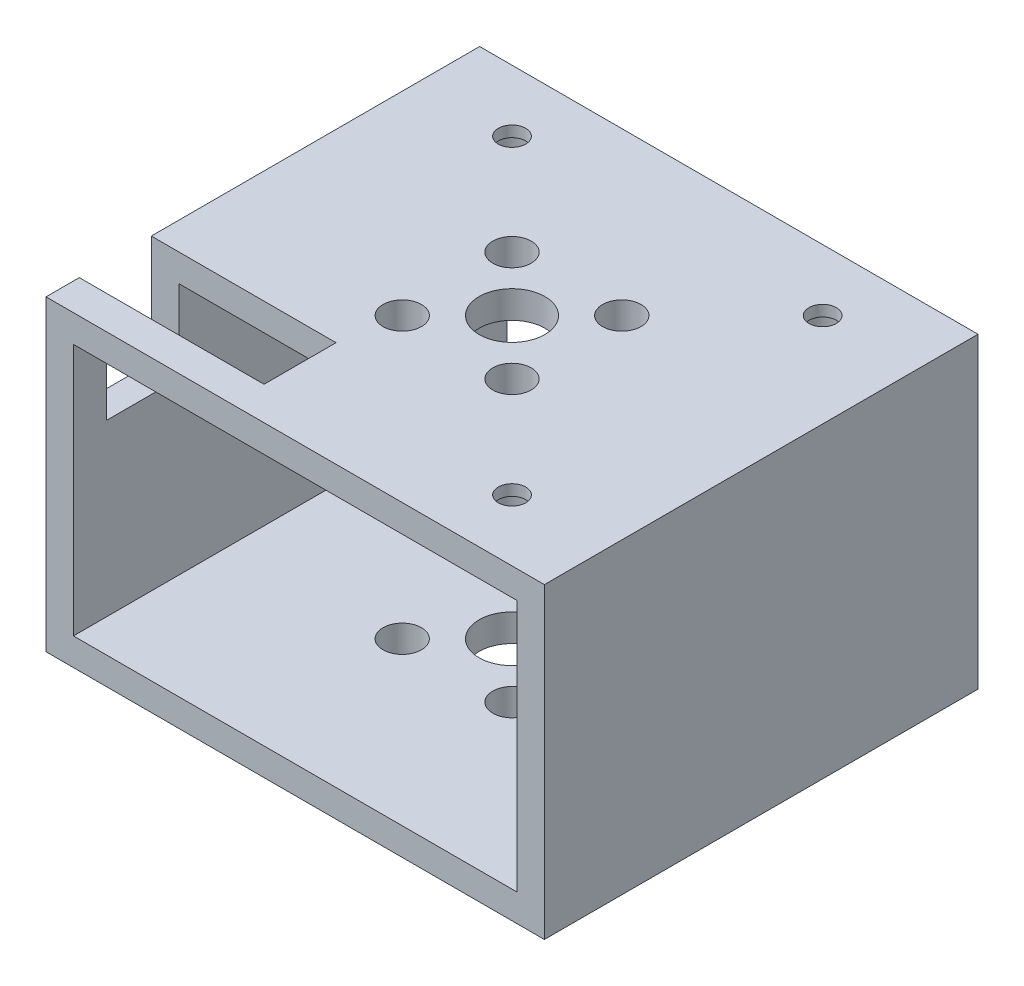
ISO-10303-21;
HEADER;
FILE_DESCRIPTION(('STEP AP214'),'2;1');
FILE_NAME('part.step','',(''),(''),'','','');
FILE_SCHEMA(('AUTOMOTIVE_DESIGN { 1 0 10303 214 1 1 1 1 }'));
ENDSEC;
DATA;
#1=APPLICATION_CONTEXT('core data for automotive mechanical design processes');
#2=APPLICATION_PROTOCOL_DEFINITION('international standard','automotive_design',2000,#1);
#3=PRODUCT_CONTEXT('',#1,'mechanical');
#4=PRODUCT('Part','Part','',(#3));
#5=PRODUCT_RELATED_PRODUCT_CATEGORY('part','',(#4));
#6=PRODUCT_DEFINITION_FORMATION('','',#4);
#7=PRODUCT_DEFINITION_CONTEXT('part definition',#1,'design');
#8=PRODUCT_DEFINITION('design','',#6,#7);
#9=PRODUCT_DEFINITION_SHAPE('','',#8);
#10=(LENGTH_UNIT() NAMED_UNIT(*) SI_UNIT(.MILLI.,.METRE.));
#11=(NAMED_UNIT(*) PLANE_ANGLE_UNIT() SI_UNIT($,.RADIAN.));
#12=(NAMED_UNIT(*) SI_UNIT($,.STERADIAN.) SOLID_ANGLE_UNIT());
#13=UNCERTAINTY_MEASURE_WITH_UNIT(LENGTH_MEASURE(1.E-05),#10,'distance_accuracy_value','');
#14=(GEOMETRIC_REPRESENTATION_CONTEXT(3) GLOBAL_UNCERTAINTY_ASSIGNED_CONTEXT((#13)) GLOBAL_UNIT_ASSIGNED_CONTEXT((#10,
#11,#12)) REPRESENTATION_CONTEXT('',''));
#15=CARTESIAN_POINT('',(0.,0.,0.));
#16=DIRECTION('',(0.,0.,1.));
#17=DIRECTION('',(1.,0.,0.));
#18=AXIS2_PLACEMENT_3D('',#15,#16,#17);
#19=CARTESIAN_POINT('',(14.15,-7.5,-14.15));
#20=DIRECTION('',(0.,1.,0.));
#21=DIRECTION('',(0.,0.,1.));
#22=AXIS2_PLACEMENT_3D('',#19,#20,#21);
#23=CYLINDRICAL_SURFACE('',#22,1.25);
#24=CARTESIAN_POINT('',(14.15,2.5,-14.15));
#25=DIRECTION('',(0.,1.,0.));
#26=DIRECTION('',(0.,0.,1.));
#27=AXIS2_PLACEMENT_3D('',#24,#25,#26);
#28=CIRCLE('',#27,1.25);
#29=CARTESIAN_POINT('',(14.15,2.5,-12.9));
#30=VERTEX_POINT('',#29);
#31=EDGE_CURVE('E225',#30,#30,#28,.T.);
#32=ORIENTED_EDGE('',*,*,#31,.T.);
#33=EDGE_LOOP('',(#32));
#34=FACE_BOUND('',#33,.T.);
#35=CARTESIAN_POINT('',(14.15,1.5,-14.15));
#36=DIRECTION('',(0.,-1.,0.));
#37=DIRECTION('',(0.,0.,-1.));
#38=AXIS2_PLACEMENT_3D('',#35,#36,#37);
#39=CIRCLE('',#38,1.25);
#40=CARTESIAN_POINT('',(14.15,1.5,-15.4));
#41=VERTEX_POINT('',#40);
#42=EDGE_CURVE('E229',#41,#41,#39,.F.);
#43=ORIENTED_EDGE('',*,*,#42,.F.);
#44=EDGE_LOOP('',(#43));
#45=FACE_BOUND('',#44,.T.);
#46=ADVANCED_FACE('F41',(#34,#45),#23,.F.);
#47=CARTESIAN_POINT('',(14.1500000000008,-7.5,14.15));
#48=DIRECTION('',(0.,1.,0.));
#49=DIRECTION('',(0.,0.,1.));
#50=AXIS2_PLACEMENT_3D('',#47,#48,#49);
#51=CYLINDRICAL_SURFACE('',#50,1.25);
#52=CARTESIAN_POINT('',(14.1500000000008,2.5,14.15));
#53=DIRECTION('',(0.,1.,0.));
#54=DIRECTION('',(0.,0.,1.));
#55=AXIS2_PLACEMENT_3D('',#52,#53,#54);
#56=CIRCLE('',#55,1.25);
#57=CARTESIAN_POINT('',(14.1500000000008,2.5,15.4));
#58=VERTEX_POINT('',#57);
#59=EDGE_CURVE('E222',#58,#58,#56,.T.);
#60=ORIENTED_EDGE('',*,*,#59,.T.);
#61=EDGE_LOOP('',(#60));
#62=FACE_BOUND('',#61,.T.);
#63=CARTESIAN_POINT('',(14.1500000000008,1.5,14.15));
#64=DIRECTION('',(0.,-1.,0.));
#65=DIRECTION('',(0.,0.,-1.));
#66=AXIS2_PLACEMENT_3D('',#63,#64,#65);
#67=CIRCLE('',#66,1.25);
#68=CARTESIAN_POINT('',(14.1500000000008,1.5,12.9));
#69=VERTEX_POINT('',#68);
#70=EDGE_CURVE('E391',#69,#69,#67,.F.);
#71=ORIENTED_EDGE('',*,*,#70,.F.);
#72=EDGE_LOOP('',(#71));
#73=FACE_BOUND('',#72,.T.);
#74=ADVANCED_FACE('F399',(#62,#73),#51,.F.);
#75=CARTESIAN_POINT('',(-14.15,-7.5,-14.1499999999992));
#76=DIRECTION('',(0.,1.,0.));
#77=DIRECTION('',(0.,0.,1.));
#78=AXIS2_PLACEMENT_3D('',#75,#76,#77);
#79=CYLINDRICAL_SURFACE('',#78,1.25);
#80=CARTESIAN_POINT('',(-14.15,2.5,-14.1499999999992));
#81=DIRECTION('',(0.,1.,0.));
#82=DIRECTION('',(0.,0.,1.));
#83=AXIS2_PLACEMENT_3D('',#80,#81,#82);
#84=CIRCLE('',#83,1.25);
#85=CARTESIAN_POINT('',(-14.15,2.5,-12.8999999999992));
#86=VERTEX_POINT('',#85);
#87=EDGE_CURVE('E226',#86,#86,#84,.T.);
#88=ORIENTED_EDGE('',*,*,#87,.T.);
#89=EDGE_LOOP('',(#88));
#90=FACE_BOUND('',#89,.T.);
#91=CARTESIAN_POINT('',(-14.15,1.5,-14.1499999999992));
#92=DIRECTION('',(0.,-1.,0.));
#93=DIRECTION('',(0.,0.,-1.));
#94=AXIS2_PLACEMENT_3D('',#91,#92,#93);
#95=CIRCLE('',#94,1.25);
#96=CARTESIAN_POINT('',(-14.15,1.5,-15.3999999999992));
#97=VERTEX_POINT('',#96);
#98=EDGE_CURVE('E219',#97,#97,#95,.F.);
#99=ORIENTED_EDGE('',*,*,#98,.F.);
#100=EDGE_LOOP('',(#99));
#101=FACE_BOUND('',#100,.T.);
#102=ADVANCED_FACE('F405',(#90,#101),#79,.F.);
#103=CARTESIAN_POINT('',(0.,2.5,-19.75));
#104=DIRECTION('',(0.,0.,-1.));
#105=DIRECTION('',(-1.,0.,0.));
#106=AXIS2_PLACEMENT_3D('',#103,#104,#105);
#107=PLANE('',#106);
#108=DIRECTION('',(1.,0.,0.));
#109=VECTOR('',#108,1.);
#110=CARTESIAN_POINT('',(-25.,-23.,-19.75));
#111=LINE('',#110,#109);
#112=CARTESIAN_POINT('',(-20.2,-23.,-19.75));
#113=VERTEX_POINT('',#112);
#114=CARTESIAN_POINT('',(20.2,-23.,-19.75));
#115=VERTEX_POINT('',#114);
#116=EDGE_CURVE('E319',#113,#115,#111,.T.);
#117=ORIENTED_EDGE('',*,*,#116,.T.);
#118=DIRECTION('',(0.,-1.,0.));
#119=VECTOR('',#118,1.);
#120=CARTESIAN_POINT('',(20.2,3.5,-19.75));
#121=LINE('',#120,#119);
#122=CARTESIAN_POINT('',(20.2,0.,-19.75));
#123=VERTEX_POINT('',#122);
#124=EDGE_CURVE('E255',#123,#115,#121,.T.);
#125=ORIENTED_EDGE('',*,*,#124,.F.);
#126=DIRECTION('',(1.,0.,0.));
#127=VECTOR('',#126,1.);
#128=CARTESIAN_POINT('',(0.,0.,-19.75));
#129=LINE('',#128,#127);
#130=CARTESIAN_POINT('',(-20.2,0.,-19.75));
#131=VERTEX_POINT('',#130);
#132=EDGE_CURVE('E368',#131,#123,#129,.T.);
#133=ORIENTED_EDGE('',*,*,#132,.F.);
#134=DIRECTION('',(0.,-1.,0.));
#135=VECTOR('',#134,1.);
#136=CARTESIAN_POINT('',(-20.2,3.5,-19.75));
#137=LINE('',#136,#135);
#138=EDGE_CURVE('E262',#131,#113,#137,.T.);
#139=ORIENTED_EDGE('',*,*,#138,.T.);
#140=EDGE_LOOP('',(#117,#125,#133,#139));
#141=FACE_BOUND('',#140,.T.);
#142=DIRECTION('',(-1.,0.,0.));
#143=VECTOR('',#142,1.);
#144=CARTESIAN_POINT('',(25.,-25.5,-19.75));
#145=LINE('',#144,#143);
#146=CARTESIAN_POINT('',(22.7,-25.5,-19.75));
#147=VERTEX_POINT('',#146);
#148=CARTESIAN_POINT('',(-22.7,-25.5,-19.75));
#149=VERTEX_POINT('',#148);
#150=EDGE_CURVE('E329',#147,#149,#145,.T.);
#151=ORIENTED_EDGE('',*,*,#150,.T.);
#152=DIRECTION('',(0.,-1.,0.));
#153=VECTOR('',#152,1.);
#154=CARTESIAN_POINT('',(-22.7,2.5,-19.75));
#155=LINE('',#154,#153);
#156=CARTESIAN_POINT('',(-22.7,2.5,-19.75));
#157=VERTEX_POINT('',#156);
#158=EDGE_CURVE('E233',#157,#149,#155,.T.);
#159=ORIENTED_EDGE('',*,*,#158,.F.);
#160=DIRECTION('',(1.,0.,0.));
#161=VECTOR('',#160,1.);
#162=CARTESIAN_POINT('',(0.,2.5,-19.75));
#163=LINE('',#162,#161);
#164=CARTESIAN_POINT('',(22.7,2.5,-19.75));
#165=VERTEX_POINT('',#164);
#166=EDGE_CURVE('E349',#157,#165,#163,.T.);
#167=ORIENTED_EDGE('',*,*,#166,.T.);
#168=DIRECTION('',(0.,1.,0.));
#169=VECTOR('',#168,1.);
#170=CARTESIAN_POINT('',(22.7,2.5,-19.75));
#171=LINE('',#170,#169);
#172=EDGE_CURVE('E235',#147,#165,#171,.T.);
#173=ORIENTED_EDGE('',*,*,#172,.F.);
#174=EDGE_LOOP('',(#151,#159,#167,#173));
#175=FACE_BOUND('',#174,.T.);
#176=ADVANCED_FACE('F481',(#141,#175),#107,.T.);
#177=CARTESIAN_POINT('',(0.,2.5,19.75));
#178=DIRECTION('',(0.,0.,-1.));
#179=DIRECTION('',(-1.,0.,0.));
#180=AXIS2_PLACEMENT_3D('',#177,#178,#179);
#181=PLANE('',#180);
#182=DIRECTION('',(0.,-1.,0.));
#183=VECTOR('',#182,1.);
#184=CARTESIAN_POINT('',(20.2,3.5,19.75));
#185=LINE('',#184,#183);
#186=CARTESIAN_POINT('',(20.2,0.,19.75));
#187=VERTEX_POINT('',#186);
#188=CARTESIAN_POINT('',(20.2,-23.,19.75));
#189=VERTEX_POINT('',#188);
#190=EDGE_CURVE('E247',#187,#189,#185,.T.);
#191=ORIENTED_EDGE('',*,*,#190,.T.);
#192=DIRECTION('',(-1.,0.,0.));
#193=VECTOR('',#192,1.);
#194=CARTESIAN_POINT('',(25.,-23.,19.75));
#195=LINE('',#194,#193);
#196=CARTESIAN_POINT('',(-20.2,-23.,19.75));
#197=VERTEX_POINT('',#196);
#198=EDGE_CURVE('E324',#189,#197,#195,.T.);
#199=ORIENTED_EDGE('',*,*,#198,.T.);
#200=DIRECTION('',(0.,-1.,0.));
#201=VECTOR('',#200,1.);
#202=CARTESIAN_POINT('',(-20.2,3.5,19.75));
#203=LINE('',#202,#201);
#204=CARTESIAN_POINT('',(-20.2,0.,19.75));
#205=VERTEX_POINT('',#204);
#206=EDGE_CURVE('E261',#205,#197,#203,.T.);
#207=ORIENTED_EDGE('',*,*,#206,.F.);
#208=DIRECTION('',(1.,0.,0.));
#209=VECTOR('',#208,1.);
#210=CARTESIAN_POINT('',(0.,0.,19.75));
#211=LINE('',#210,#209);
#212=EDGE_CURVE('E337',#205,#187,#211,.T.);
#213=ORIENTED_EDGE('',*,*,#212,.T.);
#214=EDGE_LOOP('',(#191,#199,#207,#213));
#215=FACE_BOUND('',#214,.T.);
#216=DIRECTION('',(0.,-1.,0.));
#217=VECTOR('',#216,1.);
#218=CARTESIAN_POINT('',(-22.7,2.5,19.75));
#219=LINE('',#218,#217);
#220=CARTESIAN_POINT('',(-22.7,2.5,19.75));
#221=VERTEX_POINT('',#220);
#222=CARTESIAN_POINT('',(-22.7,-25.5,19.75));
#223=VERTEX_POINT('',#222);
#224=EDGE_CURVE('E232',#221,#223,#219,.T.);
#225=ORIENTED_EDGE('',*,*,#224,.T.);
#226=DIRECTION('',(1.,0.,0.));
#227=VECTOR('',#226,1.);
#228=CARTESIAN_POINT('',(25.,-25.5,19.75));
#229=LINE('',#228,#227);
#230=CARTESIAN_POINT('',(22.7,-25.5,19.75));
#231=VERTEX_POINT('',#230);
#232=EDGE_CURVE('E326',#223,#231,#229,.T.);
#233=ORIENTED_EDGE('',*,*,#232,.T.);
#234=DIRECTION('',(0.,1.,0.));
#235=VECTOR('',#234,1.);
#236=CARTESIAN_POINT('',(22.7,2.5,19.75));
#237=LINE('',#236,#235);
#238=CARTESIAN_POINT('',(22.7,2.5,19.75));
#239=VERTEX_POINT('',#238);
#240=EDGE_CURVE('E236',#231,#239,#237,.T.);
#241=ORIENTED_EDGE('',*,*,#240,.T.);
#242=DIRECTION('',(1.,0.,0.));
#243=VECTOR('',#242,1.);
#244=CARTESIAN_POINT('',(0.,2.5,19.75));
#245=LINE('',#244,#243);
#246=EDGE_CURVE('E351',#221,#239,#245,.T.);
#247=ORIENTED_EDGE('',*,*,#246,.F.);
#248=EDGE_LOOP('',(#225,#233,#241,#247));
#249=FACE_BOUND('',#248,.T.);
#250=ADVANCED_FACE('F470',(#215,#249),#181,.F.);
#251=CARTESIAN_POINT('',(0.,-25.5,0.));
#252=DIRECTION('',(0.,-1.,0.));
#253=DIRECTION('',(0.,0.,-1.));
#254=AXIS2_PLACEMENT_3D('',#251,#252,#253);
#255=PLANE('',#254);
#256=DIRECTION('',(0.,0.,-1.));
#257=VECTOR('',#256,1.);
#258=CARTESIAN_POINT('',(-18.8746957556807,-25.5,-8.48334455744631));
#259=LINE('',#258,#257);
#260=CARTESIAN_POINT('',(-18.8746957556807,-25.5,-8.48334455744631));
#261=VERTEX_POINT('',#260);
#262=CARTESIAN_POINT('',(-18.8746957556807,-25.5,-17.7501379555667));
#263=VERTEX_POINT('',#262);
#264=EDGE_CURVE('E271',#261,#263,#259,.T.);
#265=ORIENTED_EDGE('',*,*,#264,.F.);
#266=DIRECTION('',(-1.,0.,0.));
#267=VECTOR('',#266,1.);
#268=CARTESIAN_POINT('',(-18.8746957556807,-25.5,-8.48334455744631));
#269=LINE('',#268,#267);
#270=CARTESIAN_POINT('',(-1.93295077016008,-25.5,-8.48334455744631));
#271=VERTEX_POINT('',#270);
#272=EDGE_CURVE('E279',#271,#261,#269,.T.);
#273=ORIENTED_EDGE('',*,*,#272,.F.);
#274=DIRECTION('',(0.,0.,1.));
#275=VECTOR('',#274,1.);
#276=CARTESIAN_POINT('',(-1.93295077016008,-25.5,-8.48334455744631));
#277=LINE('',#276,#275);
#278=CARTESIAN_POINT('',(-1.93295077016008,-25.5,-17.7501379555667));
#279=VERTEX_POINT('',#278);
#280=EDGE_CURVE('E276',#279,#271,#277,.T.);
#281=ORIENTED_EDGE('',*,*,#280,.F.);
#282=DIRECTION('',(1.,0.,0.));
#283=VECTOR('',#282,1.);
#284=CARTESIAN_POINT('',(-18.8746957556807,-25.5,-17.7501379555667));
#285=LINE('',#284,#283);
#286=EDGE_CURVE('E273',#263,#279,#285,.T.);
#287=ORIENTED_EDGE('',*,*,#286,.F.);
#288=EDGE_LOOP('',(#265,#273,#281,#287));
#289=FACE_BOUND('',#288,.T.);
#290=CARTESIAN_POINT('',(0.,-25.5,0.));
#291=DIRECTION('',(0.,-1.,0.));
#292=DIRECTION('',(0.,0.,-1.));
#293=AXIS2_PLACEMENT_3D('',#290,#291,#292);
#294=CIRCLE('',#293,3.);
#295=CARTESIAN_POINT('',(0.,-25.5,-3.));
#296=VERTEX_POINT('',#295);
#297=EDGE_CURVE('E285',#296,#296,#294,.T.);
#298=ORIENTED_EDGE('',*,*,#297,.F.);
#299=EDGE_LOOP('',(#298));
#300=FACE_BOUND('',#299,.T.);
#301=CARTESIAN_POINT('',(-5.,-25.5,-5.));
#302=DIRECTION('',(0.,-1.,0.));
#303=DIRECTION('',(0.,0.,-1.));
#304=AXIS2_PLACEMENT_3D('',#301,#302,#303);
#305=CIRCLE('',#304,1.75);
#306=CARTESIAN_POINT('',(-5.,-25.5,-6.75));
#307=VERTEX_POINT('',#306);
#308=EDGE_CURVE('E295',#307,#307,#305,.T.);
#309=ORIENTED_EDGE('',*,*,#308,.F.);
#310=EDGE_LOOP('',(#309));
#311=FACE_BOUND('',#310,.T.);
#312=CARTESIAN_POINT('',(5.,-25.5,-5.00000000000028));
#313=DIRECTION('',(0.,-1.,0.));
#314=DIRECTION('',(0.,0.,-1.));
#315=AXIS2_PLACEMENT_3D('',#312,#313,#314);
#316=CIRCLE('',#315,1.75000000000029);
#317=CARTESIAN_POINT('',(5.,-25.5,-6.75000000000057));
#318=VERTEX_POINT('',#317);
#319=EDGE_CURVE('E301',#318,#318,#316,.T.);
#320=ORIENTED_EDGE('',*,*,#319,.F.);
#321=EDGE_LOOP('',(#320));
#322=FACE_BOUND('',#321,.T.);
#323=CARTESIAN_POINT('',(5.00000000000028,-25.5,4.99999999999972));
#324=DIRECTION('',(0.,-1.,0.));
#325=DIRECTION('',(0.,0.,-1.));
#326=AXIS2_PLACEMENT_3D('',#323,#324,#325);
#327=CIRCLE('',#326,1.7500000000004);
#328=CARTESIAN_POINT('',(5.00000000000028,-25.5,3.24999999999933));
#329=VERTEX_POINT('',#328);
#330=EDGE_CURVE('E307',#329,#329,#327,.T.);
#331=ORIENTED_EDGE('',*,*,#330,.F.);
#332=EDGE_LOOP('',(#331));
#333=FACE_BOUND('',#332,.T.);
#334=CARTESIAN_POINT('',(-4.99999999999972,-25.5,5.));
#335=DIRECTION('',(0.,-1.,0.));
#336=DIRECTION('',(0.,0.,-1.));
#337=AXIS2_PLACEMENT_3D('',#334,#335,#336);
#338=CIRCLE('',#337,1.75000000000015);
#339=CARTESIAN_POINT('',(-4.99999999999972,-25.5,3.24999999999985));
#340=VERTEX_POINT('',#339);
#341=EDGE_CURVE('E313',#340,#340,#338,.T.);
#342=ORIENTED_EDGE('',*,*,#341,.F.);
#343=EDGE_LOOP('',(#342));
#344=FACE_BOUND('',#343,.T.);
#345=ORIENTED_EDGE('',*,*,#232,.F.);
#346=DIRECTION('',(0.,0.,1.));
#347=VECTOR('',#346,1.);
#348=CARTESIAN_POINT('',(-22.7,-25.5,-19.75));
#349=LINE('',#348,#347);
#350=EDGE_CURVE('E239',#149,#223,#349,.T.);
#351=ORIENTED_EDGE('',*,*,#350,.F.);
#352=ORIENTED_EDGE('',*,*,#150,.F.);
#353=DIRECTION('',(0.,0.,1.));
#354=VECTOR('',#353,1.);
#355=CARTESIAN_POINT('',(22.7,-25.5,-19.75));
#356=LINE('',#355,#354);
#357=EDGE_CURVE('E251',#147,#231,#356,.T.);
#358=ORIENTED_EDGE('',*,*,#357,.T.);
#359=EDGE_LOOP('',(#345,#351,#352,#358));
#360=FACE_BOUND('',#359,.T.);
#361=ADVANCED_FACE('F466',(#289,#300,#311,#322,#333,#344,#360),#255,.T.);
#362=CARTESIAN_POINT('',(0.,2.5,0.));
#363=DIRECTION('',(0.,-1.,0.));
#364=DIRECTION('',(0.,0.,-1.));
#365=AXIS2_PLACEMENT_3D('',#362,#363,#364);
#366=CYLINDRICAL_SURFACE('',#365,3.);
#367=CARTESIAN_POINT('',(0.,2.5,0.));
#368=DIRECTION('',(0.,1.,0.));
#369=DIRECTION('',(0.,0.,1.));
#370=AXIS2_PLACEMENT_3D('',#367,#368,#369);
#371=CIRCLE('',#370,3.);
#372=CARTESIAN_POINT('',(0.,2.5,3.));
#373=VERTEX_POINT('',#372);
#374=EDGE_CURVE('E346',#373,#373,#371,.T.);
#375=ORIENTED_EDGE('',*,*,#374,.T.);
#376=EDGE_LOOP('',(#375));
#377=FACE_BOUND('',#376,.T.);
#378=CARTESIAN_POINT('',(0.,0.,0.));
#379=DIRECTION('',(0.,1.,0.));
#380=DIRECTION('',(0.,0.,1.));
#381=AXIS2_PLACEMENT_3D('',#378,#379,#380);
#382=CIRCLE('',#381,3.);
#383=CARTESIAN_POINT('',(0.,0.,3.));
#384=VERTEX_POINT('',#383);
#385=EDGE_CURVE('E365',#384,#384,#382,.T.);
#386=ORIENTED_EDGE('',*,*,#385,.F.);
#387=EDGE_LOOP('',(#386));
#388=FACE_BOUND('',#387,.T.);
#389=ADVANCED_FACE('F469',(#377,#388),#366,.F.);
#390=CARTESIAN_POINT('',(-5.,2.5,-5.));
#391=DIRECTION('',(0.,-1.,0.));
#392=DIRECTION('',(0.,0.,-1.));
#393=AXIS2_PLACEMENT_3D('',#390,#391,#392);
#394=CYLINDRICAL_SURFACE('',#393,1.75);
#395=CARTESIAN_POINT('',(-5.,2.5,-5.));
#396=DIRECTION('',(0.,1.,0.));
#397=DIRECTION('',(0.,0.,1.));
#398=AXIS2_PLACEMENT_3D('',#395,#396,#397);
#399=CIRCLE('',#398,1.75);
#400=CARTESIAN_POINT('',(-5.,2.5,-3.25));
#401=VERTEX_POINT('',#400);
#402=EDGE_CURVE('E343',#401,#401,#399,.T.);
#403=ORIENTED_EDGE('',*,*,#402,.T.);
#404=EDGE_LOOP('',(#403));
#405=FACE_BOUND('',#404,.T.);
#406=CARTESIAN_POINT('',(-5.,0.,-5.));
#407=DIRECTION('',(0.,1.,0.));
#408=DIRECTION('',(0.,0.,1.));
#409=AXIS2_PLACEMENT_3D('',#406,#407,#408);
#410=CIRCLE('',#409,1.75);
#411=CARTESIAN_POINT('',(-5.,0.,-3.25));
#412=VERTEX_POINT('',#411);
#413=EDGE_CURVE('E362',#412,#412,#410,.T.);
#414=ORIENTED_EDGE('',*,*,#413,.F.);
#415=EDGE_LOOP('',(#414));
#416=FACE_BOUND('',#415,.T.);
#417=ADVANCED_FACE('F488',(#405,#416),#394,.F.);
#418=CARTESIAN_POINT('',(5.,2.5,-5.00000000000028));
#419=DIRECTION('',(0.,-1.,0.));
#420=DIRECTION('',(0.,0.,-1.));
#421=AXIS2_PLACEMENT_3D('',#418,#419,#420);
#422=CYLINDRICAL_SURFACE('',#421,1.75000000000029);
#423=CARTESIAN_POINT('',(5.,2.5,-5.00000000000028));
#424=DIRECTION('',(0.,1.,0.));
#425=DIRECTION('',(0.,0.,1.));
#426=AXIS2_PLACEMENT_3D('',#423,#424,#425);
#427=CIRCLE('',#426,1.75000000000029);
#428=CARTESIAN_POINT('',(5.,2.5,-3.24999999999999));
#429=VERTEX_POINT('',#428);
#430=EDGE_CURVE('E340',#429,#429,#427,.T.);
#431=ORIENTED_EDGE('',*,*,#430,.T.);
#432=EDGE_LOOP('',(#431));
#433=FACE_BOUND('',#432,.T.);
#434=CARTESIAN_POINT('',(5.,0.,-5.00000000000028));
#435=DIRECTION('',(0.,1.,0.));
#436=DIRECTION('',(0.,0.,1.));
#437=AXIS2_PLACEMENT_3D('',#434,#435,#436);
#438=CIRCLE('',#437,1.75000000000029);
#439=CARTESIAN_POINT('',(5.,0.,-3.24999999999999));
#440=VERTEX_POINT('',#439);
#441=EDGE_CURVE('E359',#440,#440,#438,.T.);
#442=ORIENTED_EDGE('',*,*,#441,.F.);
#443=EDGE_LOOP('',(#442));
#444=FACE_BOUND('',#443,.T.);
#445=ADVANCED_FACE('F492',(#433,#444),#422,.F.);
#446=CARTESIAN_POINT('',(5.00000000000028,2.5,4.99999999999972));
#447=DIRECTION('',(0.,-1.,0.));
#448=DIRECTION('',(0.,0.,-1.));
#449=AXIS2_PLACEMENT_3D('',#446,#447,#448);
#450=CYLINDRICAL_SURFACE('',#449,1.7500000000004);
#451=CARTESIAN_POINT('',(5.00000000000028,2.5,4.99999999999972));
#452=DIRECTION('',(0.,1.,0.));
#453=DIRECTION('',(0.,0.,1.));
#454=AXIS2_PLACEMENT_3D('',#451,#452,#453);
#455=CIRCLE('',#454,1.7500000000004);
#456=CARTESIAN_POINT('',(5.00000000000028,2.5,6.75000000000012));
#457=VERTEX_POINT('',#456);
#458=EDGE_CURVE('E336',#457,#457,#455,.T.);
#459=ORIENTED_EDGE('',*,*,#458,.T.);
#460=EDGE_LOOP('',(#459));
#461=FACE_BOUND('',#460,.T.);
#462=CARTESIAN_POINT('',(5.00000000000028,0.,4.99999999999972));
#463=DIRECTION('',(0.,1.,0.));
#464=DIRECTION('',(0.,0.,1.));
#465=AXIS2_PLACEMENT_3D('',#462,#463,#464);
#466=CIRCLE('',#465,1.7500000000004);
#467=CARTESIAN_POINT('',(5.00000000000028,0.,6.75000000000012));
#468=VERTEX_POINT('',#467);
#469=EDGE_CURVE('E356',#468,#468,#466,.T.);
#470=ORIENTED_EDGE('',*,*,#469,.F.);
#471=EDGE_LOOP('',(#470));
#472=FACE_BOUND('',#471,.T.);
#473=ADVANCED_FACE('F495',(#461,#472),#450,.F.);
#474=CARTESIAN_POINT('',(-4.99999999999972,2.5,5.));
#475=DIRECTION('',(0.,-1.,0.));
#476=DIRECTION('',(0.,0.,-1.));
#477=AXIS2_PLACEMENT_3D('',#474,#475,#476);
#478=CYLINDRICAL_SURFACE('',#477,1.75000000000015);
#479=CARTESIAN_POINT('',(-4.99999999999972,2.5,5.));
#480=DIRECTION('',(0.,1.,0.));
#481=DIRECTION('',(0.,0.,1.));
#482=AXIS2_PLACEMENT_3D('',#479,#480,#481);
#483=CIRCLE('',#482,1.75000000000015);
#484=CARTESIAN_POINT('',(-4.99999999999972,2.5,6.75000000000015));
#485=VERTEX_POINT('',#484);
#486=EDGE_CURVE('E333',#485,#485,#483,.T.);
#487=ORIENTED_EDGE('',*,*,#486,.T.);
#488=EDGE_LOOP('',(#487));
#489=FACE_BOUND('',#488,.T.);
#490=CARTESIAN_POINT('',(-4.99999999999972,0.,5.));
#491=DIRECTION('',(0.,1.,0.));
#492=DIRECTION('',(0.,0.,1.));
#493=AXIS2_PLACEMENT_3D('',#490,#491,#492);
#494=CIRCLE('',#493,1.75000000000015);
#495=CARTESIAN_POINT('',(-4.99999999999972,0.,6.75000000000015));
#496=VERTEX_POINT('',#495);
#497=EDGE_CURVE('E332',#496,#496,#494,.T.);
#498=ORIENTED_EDGE('',*,*,#497,.F.);
#499=EDGE_LOOP('',(#498));
#500=FACE_BOUND('',#499,.T.);
#501=ADVANCED_FACE('F43',(#489,#500),#478,.F.);
#502=CARTESIAN_POINT('',(0.,2.5,0.));
#503=DIRECTION('',(0.,1.,0.));
#504=DIRECTION('',(0.,0.,1.));
#505=AXIS2_PLACEMENT_3D('',#502,#503,#504);
#506=PLANE('',#505);
#507=DIRECTION('',(-1.,0.,0.));
#508=VECTOR('',#507,1.);
#509=CARTESIAN_POINT('',(-22.7,2.5,10.1571230190119));
#510=LINE('',#509,#508);
#511=CARTESIAN_POINT('',(-5.8720867453663,2.5,10.1571230190119));
#512=VERTEX_POINT('',#511);
#513=CARTESIAN_POINT('',(-22.7,2.5,10.1571230190119));
#514=VERTEX_POINT('',#513);
#515=EDGE_CURVE('E179',#512,#514,#510,.T.);
#516=ORIENTED_EDGE('',*,*,#515,.F.);
#517=DIRECTION('',(0.,0.,-1.));
#518=VECTOR('',#517,1.);
#519=CARTESIAN_POINT('',(-5.8720867453663,2.5,10.1571230190119));
#520=LINE('',#519,#518);
#521=CARTESIAN_POINT('',(-5.8720867453663,2.5,16.7169316354571));
#522=VERTEX_POINT('',#521);
#523=EDGE_CURVE('E522',#522,#512,#520,.T.);
#524=ORIENTED_EDGE('',*,*,#523,.F.);
#525=DIRECTION('',(1.,0.,0.));
#526=VECTOR('',#525,1.);
#527=CARTESIAN_POINT('',(-22.7,2.5,16.7169316354571));
#528=LINE('',#527,#526);
#529=CARTESIAN_POINT('',(-22.7,2.5,16.7169316354571));
#530=VERTEX_POINT('',#529);
#531=EDGE_CURVE('E520',#530,#522,#528,.T.);
#532=ORIENTED_EDGE('',*,*,#531,.F.);
#533=DIRECTION('',(0.,0.,1.));
#534=VECTOR('',#533,1.);
#535=CARTESIAN_POINT('',(-22.7,2.5,-19.75));
#536=LINE('',#535,#534);
#537=EDGE_CURVE('E184',#530,#221,#536,.T.);
#538=ORIENTED_EDGE('',*,*,#537,.T.);
#539=ORIENTED_EDGE('',*,*,#246,.T.);
#540=DIRECTION('',(0.,0.,1.));
#541=VECTOR('',#540,1.);
#542=CARTESIAN_POINT('',(22.7,2.5,-19.75));
#543=LINE('',#542,#541);
#544=EDGE_CURVE('E248',#165,#239,#543,.T.);
#545=ORIENTED_EDGE('',*,*,#544,.F.);
#546=ORIENTED_EDGE('',*,*,#166,.F.);
#547=EDGE_CURVE('E244',#157,#514,#536,.T.);
#548=ORIENTED_EDGE('',*,*,#547,.T.);
#549=EDGE_LOOP('',(#516,#524,#532,#538,#539,#545,#546,#548));
#550=FACE_BOUND('',#549,.T.);
#551=ORIENTED_EDGE('',*,*,#87,.F.);
#552=EDGE_LOOP('',(#551));
#553=FACE_BOUND('',#552,.T.);
#554=ORIENTED_EDGE('',*,*,#59,.F.);
#555=EDGE_LOOP('',(#554));
#556=FACE_BOUND('',#555,.T.);
#557=ORIENTED_EDGE('',*,*,#31,.F.);
#558=EDGE_LOOP('',(#557));
#559=FACE_BOUND('',#558,.T.);
#560=ORIENTED_EDGE('',*,*,#486,.F.);
#561=EDGE_LOOP('',(#560));
#562=FACE_BOUND('',#561,.T.);
#563=ORIENTED_EDGE('',*,*,#458,.F.);
#564=EDGE_LOOP('',(#563));
#565=FACE_BOUND('',#564,.T.);
#566=ORIENTED_EDGE('',*,*,#430,.F.);
#567=EDGE_LOOP('',(#566));
#568=FACE_BOUND('',#567,.T.);
#569=ORIENTED_EDGE('',*,*,#402,.F.);
#570=EDGE_LOOP('',(#569));
#571=FACE_BOUND('',#570,.T.);
#572=ORIENTED_EDGE('',*,*,#374,.F.);
#573=EDGE_LOOP('',(#572));
#574=FACE_BOUND('',#573,.T.);
#575=ADVANCED_FACE('F472',(#550,#553,#556,#559,#562,#565,#568,#571,#574),#506,.T.);
#576=CARTESIAN_POINT('',(0.,0.,0.));
#577=DIRECTION('',(0.,1.,0.));
#578=DIRECTION('',(0.,0.,1.));
#579=AXIS2_PLACEMENT_3D('',#576,#577,#578);
#580=PLANE('',#579);
#581=CARTESIAN_POINT('',(14.1499999999991,0.,-14.1500000000002));
#582=DIRECTION('',(0.,-1.,0.));
#583=DIRECTION('',(0.,0.,-1.));
#584=AXIS2_PLACEMENT_3D('',#581,#582,#583);
#585=CIRCLE('',#584,2.);
#586=CARTESIAN_POINT('',(14.1499999999991,0.,-16.1500000000002));
#587=VERTEX_POINT('',#586);
#588=EDGE_CURVE('E203',#587,#587,#585,.T.);
#589=ORIENTED_EDGE('',*,*,#588,.F.);
#590=EDGE_LOOP('',(#589));
#591=FACE_BOUND('',#590,.T.);
#592=CARTESIAN_POINT('',(14.1500000000001,0.,14.1499999999991));
#593=DIRECTION('',(0.,-1.,0.));
#594=DIRECTION('',(0.,0.,-1.));
#595=AXIS2_PLACEMENT_3D('',#592,#593,#594);
#596=CIRCLE('',#595,2.);
#597=CARTESIAN_POINT('',(14.1500000000001,0.,12.1499999999991));
#598=VERTEX_POINT('',#597);
#599=EDGE_CURVE('E208',#598,#598,#596,.T.);
#600=ORIENTED_EDGE('',*,*,#599,.F.);
#601=EDGE_LOOP('',(#600));
#602=FACE_BOUND('',#601,.T.);
#603=CARTESIAN_POINT('',(-14.15,0.,-14.1499999999992));
#604=DIRECTION('',(0.,-1.,0.));
#605=DIRECTION('',(0.,0.,-1.));
#606=AXIS2_PLACEMENT_3D('',#603,#604,#605);
#607=CIRCLE('',#606,2.);
#608=CARTESIAN_POINT('',(-14.15,0.,-16.1499999999992));
#609=VERTEX_POINT('',#608);
#610=EDGE_CURVE('E207',#609,#609,#607,.T.);
#611=ORIENTED_EDGE('',*,*,#610,.F.);
#612=EDGE_LOOP('',(#611));
#613=FACE_BOUND('',#612,.T.);
#614=ORIENTED_EDGE('',*,*,#497,.T.);
#615=EDGE_LOOP('',(#614));
#616=FACE_BOUND('',#615,.T.);
#617=ORIENTED_EDGE('',*,*,#469,.T.);
#618=EDGE_LOOP('',(#617));
#619=FACE_BOUND('',#618,.T.);
#620=ORIENTED_EDGE('',*,*,#441,.T.);
#621=EDGE_LOOP('',(#620));
#622=FACE_BOUND('',#621,.T.);
#623=ORIENTED_EDGE('',*,*,#413,.T.);
#624=EDGE_LOOP('',(#623));
#625=FACE_BOUND('',#624,.T.);
#626=ORIENTED_EDGE('',*,*,#385,.T.);
#627=EDGE_LOOP('',(#626));
#628=FACE_BOUND('',#627,.T.);
#629=DIRECTION('',(0.,0.,-1.));
#630=VECTOR('',#629,1.);
#631=CARTESIAN_POINT('',(-5.8720867453663,0.,0.));
#632=LINE('',#631,#630);
#633=CARTESIAN_POINT('',(-5.8720867453663,0.,16.7169316354571));
#634=VERTEX_POINT('',#633);
#635=CARTESIAN_POINT('',(-5.8720867453663,0.,10.1571230190119));
#636=VERTEX_POINT('',#635);
#637=EDGE_CURVE('E12',#634,#636,#632,.T.);
#638=ORIENTED_EDGE('',*,*,#637,.T.);
#639=DIRECTION('',(-1.,0.,0.));
#640=VECTOR('',#639,1.);
#641=CARTESIAN_POINT('',(0.,0.,10.1571230190119));
#642=LINE('',#641,#640);
#643=CARTESIAN_POINT('',(-20.2,0.,10.1571230190119));
#644=VERTEX_POINT('',#643);
#645=EDGE_CURVE('E200',#636,#644,#642,.T.);
#646=ORIENTED_EDGE('',*,*,#645,.T.);
#647=DIRECTION('',(0.,0.,-1.));
#648=VECTOR('',#647,1.);
#649=CARTESIAN_POINT('',(-20.2,0.,0.));
#650=LINE('',#649,#648);
#651=EDGE_CURVE('E265',#644,#131,#650,.T.);
#652=ORIENTED_EDGE('',*,*,#651,.T.);
#653=ORIENTED_EDGE('',*,*,#132,.T.);
#654=DIRECTION('',(0.,0.,1.));
#655=VECTOR('',#654,1.);
#656=CARTESIAN_POINT('',(20.2,0.,0.));
#657=LINE('',#656,#655);
#658=EDGE_CURVE('E257',#123,#187,#657,.T.);
#659=ORIENTED_EDGE('',*,*,#658,.T.);
#660=ORIENTED_EDGE('',*,*,#212,.F.);
#661=CARTESIAN_POINT('',(-20.2,0.,16.7169316354571));
#662=VERTEX_POINT('',#661);
#663=EDGE_CURVE('E268',#205,#662,#650,.T.);
#664=ORIENTED_EDGE('',*,*,#663,.T.);
#665=DIRECTION('',(1.,0.,0.));
#666=VECTOR('',#665,1.);
#667=CARTESIAN_POINT('',(0.,0.,16.7169316354571));
#668=LINE('',#667,#666);
#669=EDGE_CURVE('E195',#662,#634,#668,.T.);
#670=ORIENTED_EDGE('',*,*,#669,.T.);
#671=EDGE_LOOP('',(#638,#646,#652,#653,#659,#660,#664,#670));
#672=FACE_BOUND('',#671,.T.);
#673=ADVANCED_FACE('F464',(#591,#602,#613,#616,#619,#622,#625,#628,#672),#580,.F.);
#674=CARTESIAN_POINT('',(0.,-23.,0.));
#675=DIRECTION('',(0.,-1.,0.));
#676=DIRECTION('',(0.,0.,-1.));
#677=AXIS2_PLACEMENT_3D('',#674,#675,#676);
#678=PLANE('',#677);
#679=DIRECTION('',(-1.,0.,0.));
#680=VECTOR('',#679,1.);
#681=CARTESIAN_POINT('',(0.,-23.,-8.48334455744631));
#682=LINE('',#681,#680);
#683=CARTESIAN_POINT('',(-1.93295077016008,-23.,-8.48334455744631));
#684=VERTEX_POINT('',#683);
#685=CARTESIAN_POINT('',(-18.8746957556807,-23.,-8.48334455744631));
#686=VERTEX_POINT('',#685);
#687=EDGE_CURVE('E378',#684,#686,#682,.T.);
#688=ORIENTED_EDGE('',*,*,#687,.T.);
#689=DIRECTION('',(0.,0.,-1.));
#690=VECTOR('',#689,1.);
#691=CARTESIAN_POINT('',(-18.8746957556807,-23.,0.));
#692=LINE('',#691,#690);
#693=CARTESIAN_POINT('',(-18.8746957556807,-23.,-17.7501379555667));
#694=VERTEX_POINT('',#693);
#695=EDGE_CURVE('E381',#686,#694,#692,.T.);
#696=ORIENTED_EDGE('',*,*,#695,.T.);
#697=DIRECTION('',(1.,0.,0.));
#698=VECTOR('',#697,1.);
#699=CARTESIAN_POINT('',(0.,-23.,-17.7501379555667));
#700=LINE('',#699,#698);
#701=CARTESIAN_POINT('',(-1.93295077016008,-23.,-17.7501379555667));
#702=VERTEX_POINT('',#701);
#703=EDGE_CURVE('E353',#694,#702,#700,.T.);
#704=ORIENTED_EDGE('',*,*,#703,.T.);
#705=DIRECTION('',(0.,0.,1.));
#706=VECTOR('',#705,1.);
#707=CARTESIAN_POINT('',(-1.93295077016008,-23.,0.));
#708=LINE('',#707,#706);
#709=EDGE_CURVE('E375',#702,#684,#708,.T.);
#710=ORIENTED_EDGE('',*,*,#709,.T.);
#711=EDGE_LOOP('',(#688,#696,#704,#710));
#712=FACE_BOUND('',#711,.T.);
#713=CARTESIAN_POINT('',(0.,-23.,0.));
#714=DIRECTION('',(0.,-1.,0.));
#715=DIRECTION('',(0.,0.,-1.));
#716=AXIS2_PLACEMENT_3D('',#713,#714,#715);
#717=CIRCLE('',#716,3.);
#718=CARTESIAN_POINT('',(0.,-23.,-3.));
#719=VERTEX_POINT('',#718);
#720=EDGE_CURVE('E292',#719,#719,#717,.T.);
#721=ORIENTED_EDGE('',*,*,#720,.T.);
#722=EDGE_LOOP('',(#721));
#723=FACE_BOUND('',#722,.T.);
#724=CARTESIAN_POINT('',(-5.,-23.,-5.));
#725=DIRECTION('',(0.,-1.,0.));
#726=DIRECTION('',(0.,0.,-1.));
#727=AXIS2_PLACEMENT_3D('',#724,#725,#726);
#728=CIRCLE('',#727,1.75);
#729=CARTESIAN_POINT('',(-5.,-23.,-6.75));
#730=VERTEX_POINT('',#729);
#731=EDGE_CURVE('E298',#730,#730,#728,.T.);
#732=ORIENTED_EDGE('',*,*,#731,.T.);
#733=EDGE_LOOP('',(#732));
#734=FACE_BOUND('',#733,.T.);
#735=CARTESIAN_POINT('',(5.,-23.,-5.00000000000028));
#736=DIRECTION('',(0.,-1.,0.));
#737=DIRECTION('',(0.,0.,-1.));
#738=AXIS2_PLACEMENT_3D('',#735,#736,#737);
#739=CIRCLE('',#738,1.75000000000029);
#740=CARTESIAN_POINT('',(5.,-23.,-6.75000000000057));
#741=VERTEX_POINT('',#740);
#742=EDGE_CURVE('E304',#741,#741,#739,.T.);
#743=ORIENTED_EDGE('',*,*,#742,.T.);
#744=EDGE_LOOP('',(#743));
#745=FACE_BOUND('',#744,.T.);
#746=CARTESIAN_POINT('',(5.00000000000028,-23.,4.99999999999972));
#747=DIRECTION('',(0.,-1.,0.));
#748=DIRECTION('',(0.,0.,-1.));
#749=AXIS2_PLACEMENT_3D('',#746,#747,#748);
#750=CIRCLE('',#749,1.7500000000004);
#751=CARTESIAN_POINT('',(5.00000000000028,-23.,3.24999999999933));
#752=VERTEX_POINT('',#751);
#753=EDGE_CURVE('E310',#752,#752,#750,.T.);
#754=ORIENTED_EDGE('',*,*,#753,.T.);
#755=EDGE_LOOP('',(#754));
#756=FACE_BOUND('',#755,.T.);
#757=CARTESIAN_POINT('',(-4.99999999999972,-23.,5.));
#758=DIRECTION('',(0.,-1.,0.));
#759=DIRECTION('',(0.,0.,-1.));
#760=AXIS2_PLACEMENT_3D('',#757,#758,#759);
#761=CIRCLE('',#760,1.75000000000015);
#762=CARTESIAN_POINT('',(-4.99999999999972,-23.,3.24999999999985));
#763=VERTEX_POINT('',#762);
#764=EDGE_CURVE('E316',#763,#763,#761,.T.);
#765=ORIENTED_EDGE('',*,*,#764,.T.);
#766=EDGE_LOOP('',(#765));
#767=FACE_BOUND('',#766,.T.);
#768=ORIENTED_EDGE('',*,*,#198,.F.);
#769=DIRECTION('',(0.,0.,-1.));
#770=VECTOR('',#769,1.);
#771=CARTESIAN_POINT('',(20.2,-23.,0.));
#772=LINE('',#771,#770);
#773=EDGE_CURVE('E49',#189,#115,#772,.T.);
#774=ORIENTED_EDGE('',*,*,#773,.T.);
#775=ORIENTED_EDGE('',*,*,#116,.F.);
#776=DIRECTION('',(0.,0.,1.));
#777=VECTOR('',#776,1.);
#778=CARTESIAN_POINT('',(-20.2,-23.,0.));
#779=LINE('',#778,#777);
#780=EDGE_CURVE('E384',#113,#197,#779,.T.);
#781=ORIENTED_EDGE('',*,*,#780,.T.);
#782=EDGE_LOOP('',(#768,#774,#775,#781));
#783=FACE_BOUND('',#782,.T.);
#784=ADVANCED_FACE('F460',(#712,#723,#734,#745,#756,#767,#783),#678,.F.);
#785=CARTESIAN_POINT('',(-4.99999999999972,-23.,5.));
#786=DIRECTION('',(0.,-1.,0.));
#787=DIRECTION('',(0.,0.,-1.));
#788=AXIS2_PLACEMENT_3D('',#785,#786,#787);
#789=CYLINDRICAL_SURFACE('',#788,1.75000000000015);
#790=ORIENTED_EDGE('',*,*,#764,.F.);
#791=EDGE_LOOP('',(#790));
#792=FACE_BOUND('',#791,.T.);
#793=ORIENTED_EDGE('',*,*,#341,.T.);
#794=EDGE_LOOP('',(#793));
#795=FACE_BOUND('',#794,.T.);
#796=ADVANCED_FACE('F456',(#792,#795),#789,.F.);
#797=CARTESIAN_POINT('',(5.00000000000028,-23.,4.99999999999972));
#798=DIRECTION('',(0.,-1.,0.));
#799=DIRECTION('',(0.,0.,-1.));
#800=AXIS2_PLACEMENT_3D('',#797,#798,#799);
#801=CYLINDRICAL_SURFACE('',#800,1.7500000000004);
#802=ORIENTED_EDGE('',*,*,#753,.F.);
#803=EDGE_LOOP('',(#802));
#804=FACE_BOUND('',#803,.T.);
#805=ORIENTED_EDGE('',*,*,#330,.T.);
#806=EDGE_LOOP('',(#805));
#807=FACE_BOUND('',#806,.T.);
#808=ADVANCED_FACE('F452',(#804,#807),#801,.F.);
#809=CARTESIAN_POINT('',(5.,-23.,-5.00000000000028));
#810=DIRECTION('',(0.,-1.,0.));
#811=DIRECTION('',(0.,0.,-1.));
#812=AXIS2_PLACEMENT_3D('',#809,#810,#811);
#813=CYLINDRICAL_SURFACE('',#812,1.75000000000029);
#814=ORIENTED_EDGE('',*,*,#742,.F.);
#815=EDGE_LOOP('',(#814));
#816=FACE_BOUND('',#815,.T.);
#817=ORIENTED_EDGE('',*,*,#319,.T.);
#818=EDGE_LOOP('',(#817));
#819=FACE_BOUND('',#818,.T.);
#820=ADVANCED_FACE('F448',(#816,#819),#813,.F.);
#821=CARTESIAN_POINT('',(-5.,-23.,-5.));
#822=DIRECTION('',(0.,-1.,0.));
#823=DIRECTION('',(0.,0.,-1.));
#824=AXIS2_PLACEMENT_3D('',#821,#822,#823);
#825=CYLINDRICAL_SURFACE('',#824,1.75);
#826=ORIENTED_EDGE('',*,*,#731,.F.);
#827=EDGE_LOOP('',(#826));
#828=FACE_BOUND('',#827,.T.);
#829=ORIENTED_EDGE('',*,*,#308,.T.);
#830=EDGE_LOOP('',(#829));
#831=FACE_BOUND('',#830,.T.);
#832=ADVANCED_FACE('F444',(#828,#831),#825,.F.);
#833=CARTESIAN_POINT('',(0.,-23.,0.));
#834=DIRECTION('',(0.,-1.,0.));
#835=DIRECTION('',(0.,0.,-1.));
#836=AXIS2_PLACEMENT_3D('',#833,#834,#835);
#837=CYLINDRICAL_SURFACE('',#836,3.);
#838=ORIENTED_EDGE('',*,*,#720,.F.);
#839=EDGE_LOOP('',(#838));
#840=FACE_BOUND('',#839,.T.);
#841=ORIENTED_EDGE('',*,*,#297,.T.);
#842=EDGE_LOOP('',(#841));
#843=FACE_BOUND('',#842,.T.);
#844=ADVANCED_FACE('F440',(#840,#843),#837,.F.);
#845=CARTESIAN_POINT('',(-18.8746957556807,-15.5,-8.48334455744631));
#846=DIRECTION('',(-1.,0.,0.));
#847=DIRECTION('',(0.,0.,1.));
#848=AXIS2_PLACEMENT_3D('',#845,#846,#847);
#849=PLANE('',#848);
#850=DIRECTION('',(0.,-1.,0.));
#851=VECTOR('',#850,1.);
#852=CARTESIAN_POINT('',(-18.8746957556807,-15.5,-8.48334455744631));
#853=LINE('',#852,#851);
#854=EDGE_CURVE('E283',#686,#261,#853,.T.);
#855=ORIENTED_EDGE('',*,*,#854,.T.);
#856=ORIENTED_EDGE('',*,*,#264,.T.);
#857=DIRECTION('',(0.,-1.,0.));
#858=VECTOR('',#857,1.);
#859=CARTESIAN_POINT('',(-18.8746957556807,-15.5,-17.7501379555667));
#860=LINE('',#859,#858);
#861=EDGE_CURVE('E282',#694,#263,#860,.T.);
#862=ORIENTED_EDGE('',*,*,#861,.F.);
#863=ORIENTED_EDGE('',*,*,#695,.F.);
#864=EDGE_LOOP('',(#855,#856,#862,#863));
#865=FACE_BOUND('',#864,.T.);
#866=ADVANCED_FACE('F430',(#865),#849,.F.);
#867=CARTESIAN_POINT('',(-18.8746957556807,-15.5,-8.48334455744631));
#868=DIRECTION('',(0.,0.,1.));
#869=DIRECTION('',(1.,0.,0.));
#870=AXIS2_PLACEMENT_3D('',#867,#868,#869);
#871=PLANE('',#870);
#872=DIRECTION('',(0.,-1.,0.));
#873=VECTOR('',#872,1.);
#874=CARTESIAN_POINT('',(-1.93295077016008,-15.5,-8.48334455744631));
#875=LINE('',#874,#873);
#876=EDGE_CURVE('E286',#684,#271,#875,.T.);
#877=ORIENTED_EDGE('',*,*,#876,.T.);
#878=ORIENTED_EDGE('',*,*,#272,.T.);
#879=ORIENTED_EDGE('',*,*,#854,.F.);
#880=ORIENTED_EDGE('',*,*,#687,.F.);
#881=EDGE_LOOP('',(#877,#878,#879,#880));
#882=FACE_BOUND('',#881,.T.);
#883=ADVANCED_FACE('F426',(#882),#871,.F.);
#884=CARTESIAN_POINT('',(-1.93295077016008,-15.5,-8.48334455744631));
#885=DIRECTION('',(1.,0.,0.));
#886=DIRECTION('',(0.,0.,-1.));
#887=AXIS2_PLACEMENT_3D('',#884,#885,#886);
#888=PLANE('',#887);
#889=DIRECTION('',(0.,-1.,0.));
#890=VECTOR('',#889,1.);
#891=CARTESIAN_POINT('',(-1.93295077016008,-15.5,-17.7501379555667));
#892=LINE('',#891,#890);
#893=EDGE_CURVE('E288',#702,#279,#892,.T.);
#894=ORIENTED_EDGE('',*,*,#893,.T.);
#895=ORIENTED_EDGE('',*,*,#280,.T.);
#896=ORIENTED_EDGE('',*,*,#876,.F.);
#897=ORIENTED_EDGE('',*,*,#709,.F.);
#898=EDGE_LOOP('',(#894,#895,#896,#897));
#899=FACE_BOUND('',#898,.T.);
#900=ADVANCED_FACE('F429',(#899),#888,.F.);
#901=CARTESIAN_POINT('',(-18.8746957556807,-15.5,-17.7501379555667));
#902=DIRECTION('',(0.,0.,-1.));
#903=DIRECTION('',(-1.,0.,0.));
#904=AXIS2_PLACEMENT_3D('',#901,#902,#903);
#905=PLANE('',#904);
#906=ORIENTED_EDGE('',*,*,#861,.T.);
#907=ORIENTED_EDGE('',*,*,#286,.T.);
#908=ORIENTED_EDGE('',*,*,#893,.F.);
#909=ORIENTED_EDGE('',*,*,#703,.F.);
#910=EDGE_LOOP('',(#906,#907,#908,#909));
#911=FACE_BOUND('',#910,.T.);
#912=ADVANCED_FACE('F424',(#911),#905,.F.);
#913=CARTESIAN_POINT('',(-20.2,3.5,19.75));
#914=DIRECTION('',(1.,0.,0.));
#915=DIRECTION('',(0.,0.,-1.));
#916=AXIS2_PLACEMENT_3D('',#913,#914,#915);
#917=PLANE('',#916);
#918=DIRECTION('',(0.,1.,0.));
#919=VECTOR('',#918,1.);
#920=CARTESIAN_POINT('',(-20.2,3.5,10.1571230190119));
#921=LINE('',#920,#919);
#922=CARTESIAN_POINT('',(-20.2,-7.5,10.1571230190119));
#923=VERTEX_POINT('',#922);
#924=EDGE_CURVE('E198',#923,#644,#921,.T.);
#925=ORIENTED_EDGE('',*,*,#924,.F.);
#926=DIRECTION('',(0.,0.,1.));
#927=VECTOR('',#926,1.);
#928=CARTESIAN_POINT('',(-20.2,-7.5,19.75));
#929=LINE('',#928,#927);
#930=CARTESIAN_POINT('',(-20.2,-7.5,16.7169316354571));
#931=VERTEX_POINT('',#930);
#932=EDGE_CURVE('E192',#923,#931,#929,.T.);
#933=ORIENTED_EDGE('',*,*,#932,.T.);
#934=DIRECTION('',(0.,-1.,0.));
#935=VECTOR('',#934,1.);
#936=CARTESIAN_POINT('',(-20.2,3.5,16.7169316354571));
#937=LINE('',#936,#935);
#938=EDGE_CURVE('E171',#662,#931,#937,.T.);
#939=ORIENTED_EDGE('',*,*,#938,.F.);
#940=ORIENTED_EDGE('',*,*,#663,.F.);
#941=ORIENTED_EDGE('',*,*,#206,.T.);
#942=ORIENTED_EDGE('',*,*,#780,.F.);
#943=ORIENTED_EDGE('',*,*,#138,.F.);
#944=ORIENTED_EDGE('',*,*,#651,.F.);
#945=EDGE_LOOP('',(#925,#933,#939,#940,#941,#942,#943,#944));
#946=FACE_BOUND('',#945,.T.);
#947=ADVANCED_FACE('F420',(#946),#917,.T.);
#948=CARTESIAN_POINT('',(20.2,3.5,19.75));
#949=DIRECTION('',(-1.,0.,0.));
#950=DIRECTION('',(0.,0.,1.));
#951=AXIS2_PLACEMENT_3D('',#948,#949,#950);
#952=PLANE('',#951);
#953=ORIENTED_EDGE('',*,*,#658,.F.);
#954=ORIENTED_EDGE('',*,*,#124,.T.);
#955=ORIENTED_EDGE('',*,*,#773,.F.);
#956=ORIENTED_EDGE('',*,*,#190,.F.);
#957=EDGE_LOOP('',(#953,#954,#955,#956));
#958=FACE_BOUND('',#957,.T.);
#959=ADVANCED_FACE('F413',(#958),#952,.T.);
#960=CARTESIAN_POINT('',(22.7,2.5,-19.75));
#961=DIRECTION('',(1.,0.,0.));
#962=DIRECTION('',(0.,0.,-1.));
#963=AXIS2_PLACEMENT_3D('',#960,#961,#962);
#964=PLANE('',#963);
#965=ORIENTED_EDGE('',*,*,#240,.F.);
#966=ORIENTED_EDGE('',*,*,#357,.F.);
#967=ORIENTED_EDGE('',*,*,#172,.T.);
#968=ORIENTED_EDGE('',*,*,#544,.T.);
#969=EDGE_LOOP('',(#965,#966,#967,#968));
#970=FACE_BOUND('',#969,.T.);
#971=ADVANCED_FACE('F410',(#970),#964,.T.);
#972=CARTESIAN_POINT('',(-22.7,2.5,-19.75));
#973=DIRECTION('',(-1.,0.,0.));
#974=DIRECTION('',(0.,-1.,0.));
#975=AXIS2_PLACEMENT_3D('',#972,#973,#974);
#976=PLANE('',#975);
#977=DIRECTION('',(0.,1.,0.));
#978=VECTOR('',#977,1.);
#979=CARTESIAN_POINT('',(-22.7,-7.5,10.1571230190119));
#980=LINE('',#979,#978);
#981=CARTESIAN_POINT('',(-22.7,-7.5,10.1571230190119));
#982=VERTEX_POINT('',#981);
#983=EDGE_CURVE('E64',#982,#514,#980,.T.);
#984=ORIENTED_EDGE('',*,*,#983,.T.);
#985=ORIENTED_EDGE('',*,*,#547,.F.);
#986=ORIENTED_EDGE('',*,*,#158,.T.);
#987=ORIENTED_EDGE('',*,*,#350,.T.);
#988=ORIENTED_EDGE('',*,*,#224,.F.);
#989=ORIENTED_EDGE('',*,*,#537,.F.);
#990=DIRECTION('',(0.,1.,0.));
#991=VECTOR('',#990,1.);
#992=CARTESIAN_POINT('',(-22.7,-7.5,16.7169316354571));
#993=LINE('',#992,#991);
#994=CARTESIAN_POINT('',(-22.7,-7.5,16.7169316354571));
#995=VERTEX_POINT('',#994);
#996=EDGE_CURVE('E168',#995,#530,#993,.T.);
#997=ORIENTED_EDGE('',*,*,#996,.F.);
#998=DIRECTION('',(0.,0.,1.));
#999=VECTOR('',#998,1.);
#1000=CARTESIAN_POINT('',(-22.7,-7.5,10.1571230190119));
#1001=LINE('',#1000,#999);
#1002=EDGE_CURVE('E174',#982,#995,#1001,.T.);
#1003=ORIENTED_EDGE('',*,*,#1002,.F.);
#1004=EDGE_LOOP('',(#984,#985,#986,#987,#988,#989,#997,#1003));
#1005=FACE_BOUND('',#1004,.T.);
#1006=ADVANCED_FACE('F182',(#1005),#976,.T.);
#1007=CARTESIAN_POINT('',(-14.15,1.5,-14.1499999999992));
#1008=DIRECTION('',(0.,-1.,0.));
#1009=DIRECTION('',(0.,0.,-1.));
#1010=AXIS2_PLACEMENT_3D('',#1007,#1008,#1009);
#1011=PLANE('',#1010);
#1012=CARTESIAN_POINT('',(-14.15,1.5,-14.1499999999992));
#1013=DIRECTION('',(0.,-1.,0.));
#1014=DIRECTION('',(0.,0.,-1.));
#1015=AXIS2_PLACEMENT_3D('',#1012,#1013,#1014);
#1016=CIRCLE('',#1015,2.);
#1017=CARTESIAN_POINT('',(-14.15,1.5,-16.1499999999992));
#1018=VERTEX_POINT('',#1017);
#1019=EDGE_CURVE('E216',#1018,#1018,#1016,.T.);
#1020=ORIENTED_EDGE('',*,*,#1019,.T.);
#1021=EDGE_LOOP('',(#1020));
#1022=FACE_BOUND('',#1021,.T.);
#1023=ORIENTED_EDGE('',*,*,#98,.T.);
#1024=EDGE_LOOP('',(#1023));
#1025=FACE_BOUND('',#1024,.T.);
#1026=ADVANCED_FACE('F417',(#1022,#1025),#1011,.T.);
#1027=CARTESIAN_POINT('',(-14.15,1.5,-14.1499999999992));
#1028=DIRECTION('',(0.,-1.,0.));
#1029=DIRECTION('',(0.,0.,-1.));
#1030=AXIS2_PLACEMENT_3D('',#1027,#1028,#1029);
#1031=CYLINDRICAL_SURFACE('',#1030,2.);
#1032=ORIENTED_EDGE('',*,*,#1019,.F.);
#1033=EDGE_LOOP('',(#1032));
#1034=FACE_BOUND('',#1033,.T.);
#1035=ORIENTED_EDGE('',*,*,#610,.T.);
#1036=EDGE_LOOP('',(#1035));
#1037=FACE_BOUND('',#1036,.T.);
#1038=ADVANCED_FACE('F566',(#1034,#1037),#1031,.F.);
#1039=CARTESIAN_POINT('',(14.1500000000001,1.5,14.1499999999991));
#1040=DIRECTION('',(0.,-1.,0.));
#1041=DIRECTION('',(0.,0.,-1.));
#1042=AXIS2_PLACEMENT_3D('',#1039,#1040,#1041);
#1043=PLANE('',#1042);
#1044=CARTESIAN_POINT('',(14.1500000000001,1.5,14.1499999999991));
#1045=DIRECTION('',(0.,-1.,0.));
#1046=DIRECTION('',(0.,0.,-1.));
#1047=AXIS2_PLACEMENT_3D('',#1044,#1045,#1046);
#1048=CIRCLE('',#1047,2.);
#1049=CARTESIAN_POINT('',(14.1500000000001,1.5,12.1499999999991));
#1050=VERTEX_POINT('',#1049);
#1051=EDGE_CURVE('E204',#1050,#1050,#1048,.T.);
#1052=ORIENTED_EDGE('',*,*,#1051,.T.);
#1053=EDGE_LOOP('',(#1052));
#1054=FACE_BOUND('',#1053,.T.);
#1055=ORIENTED_EDGE('',*,*,#70,.T.);
#1056=EDGE_LOOP('',(#1055));
#1057=FACE_BOUND('',#1056,.T.);
#1058=ADVANCED_FACE('F562',(#1054,#1057),#1043,.T.);
#1059=CARTESIAN_POINT('',(14.1500000000001,1.5,14.1499999999991));
#1060=DIRECTION('',(0.,-1.,0.));
#1061=DIRECTION('',(0.,0.,-1.));
#1062=AXIS2_PLACEMENT_3D('',#1059,#1060,#1061);
#1063=CYLINDRICAL_SURFACE('',#1062,2.);
#1064=ORIENTED_EDGE('',*,*,#1051,.F.);
#1065=EDGE_LOOP('',(#1064));
#1066=FACE_BOUND('',#1065,.T.);
#1067=ORIENTED_EDGE('',*,*,#599,.T.);
#1068=EDGE_LOOP('',(#1067));
#1069=FACE_BOUND('',#1068,.T.);
#1070=ADVANCED_FACE('F565',(#1066,#1069),#1063,.F.);
#1071=CARTESIAN_POINT('',(14.1499999999991,1.5,-14.1500000000002));
#1072=DIRECTION('',(0.,-1.,0.));
#1073=DIRECTION('',(0.,0.,-1.));
#1074=AXIS2_PLACEMENT_3D('',#1071,#1072,#1073);
#1075=PLANE('',#1074);
#1076=CARTESIAN_POINT('',(14.1499999999991,1.5,-14.1500000000002));
#1077=DIRECTION('',(0.,-1.,0.));
#1078=DIRECTION('',(0.,0.,-1.));
#1079=AXIS2_PLACEMENT_3D('',#1076,#1077,#1078);
#1080=CIRCLE('',#1079,2.);
#1081=CARTESIAN_POINT('',(14.1499999999991,1.5,-16.1500000000002));
#1082=VERTEX_POINT('',#1081);
#1083=EDGE_CURVE('E211',#1082,#1082,#1080,.T.);
#1084=ORIENTED_EDGE('',*,*,#1083,.T.);
#1085=EDGE_LOOP('',(#1084));
#1086=FACE_BOUND('',#1085,.T.);
#1087=ORIENTED_EDGE('',*,*,#42,.T.);
#1088=EDGE_LOOP('',(#1087));
#1089=FACE_BOUND('',#1088,.T.);
#1090=ADVANCED_FACE('F396',(#1086,#1089),#1075,.T.);
#1091=CARTESIAN_POINT('',(14.1499999999991,1.5,-14.1500000000002));
#1092=DIRECTION('',(0.,-1.,0.));
#1093=DIRECTION('',(0.,0.,-1.));
#1094=AXIS2_PLACEMENT_3D('',#1091,#1092,#1093);
#1095=CYLINDRICAL_SURFACE('',#1094,2.);
#1096=ORIENTED_EDGE('',*,*,#1083,.F.);
#1097=EDGE_LOOP('',(#1096));
#1098=FACE_BOUND('',#1097,.T.);
#1099=ORIENTED_EDGE('',*,*,#588,.T.);
#1100=EDGE_LOOP('',(#1099));
#1101=FACE_BOUND('',#1100,.T.);
#1102=ADVANCED_FACE('F558',(#1098,#1101),#1095,.F.);
#1103=CARTESIAN_POINT('',(-5.8720867453663,-7.5,10.1571230190119));
#1104=DIRECTION('',(1.,0.,0.));
#1105=DIRECTION('',(0.,0.,-1.));
#1106=AXIS2_PLACEMENT_3D('',#1103,#1104,#1105);
#1107=PLANE('',#1106);
#1108=DIRECTION('',(0.,1.,0.));
#1109=VECTOR('',#1108,1.);
#1110=CARTESIAN_POINT('',(-5.8720867453663,-7.5,16.7169316354571));
#1111=LINE('',#1110,#1109);
#1112=EDGE_CURVE('E185',#634,#522,#1111,.T.);
#1113=ORIENTED_EDGE('',*,*,#1112,.T.);
#1114=ORIENTED_EDGE('',*,*,#523,.T.);
#1115=DIRECTION('',(0.,1.,0.));
#1116=VECTOR('',#1115,1.);
#1117=CARTESIAN_POINT('',(-5.8720867453663,-7.5,10.1571230190119));
#1118=LINE('',#1117,#1116);
#1119=EDGE_CURVE('E187',#636,#512,#1118,.T.);
#1120=ORIENTED_EDGE('',*,*,#1119,.F.);
#1121=ORIENTED_EDGE('',*,*,#637,.F.);
#1122=EDGE_LOOP('',(#1113,#1114,#1120,#1121));
#1123=FACE_BOUND('',#1122,.T.);
#1124=ADVANCED_FACE('F518',(#1123),#1107,.F.);
#1125=CARTESIAN_POINT('',(-22.7,-7.5,10.1571230190119));
#1126=DIRECTION('',(0.,0.,-1.));
#1127=DIRECTION('',(-1.,0.,0.));
#1128=AXIS2_PLACEMENT_3D('',#1125,#1126,#1127);
#1129=PLANE('',#1128);
#1130=ORIENTED_EDGE('',*,*,#1119,.T.);
#1131=ORIENTED_EDGE('',*,*,#515,.T.);
#1132=ORIENTED_EDGE('',*,*,#983,.F.);
#1133=DIRECTION('',(-1.,0.,0.));
#1134=VECTOR('',#1133,1.);
#1135=CARTESIAN_POINT('',(-22.7,-7.5,10.1571230190119));
#1136=LINE('',#1135,#1134);
#1137=EDGE_CURVE('E173',#923,#982,#1136,.T.);
#1138=ORIENTED_EDGE('',*,*,#1137,.F.);
#1139=ORIENTED_EDGE('',*,*,#924,.T.);
#1140=ORIENTED_EDGE('',*,*,#645,.F.);
#1141=EDGE_LOOP('',(#1130,#1131,#1132,#1138,#1139,#1140));
#1142=FACE_BOUND('',#1141,.T.);
#1143=ADVANCED_FACE('F529',(#1142),#1129,.F.);
#1144=CARTESIAN_POINT('',(-22.7,-7.5,16.7169316354571));
#1145=DIRECTION('',(0.,0.,1.));
#1146=DIRECTION('',(1.,0.,0.));
#1147=AXIS2_PLACEMENT_3D('',#1144,#1145,#1146);
#1148=PLANE('',#1147);
#1149=ORIENTED_EDGE('',*,*,#938,.T.);
#1150=DIRECTION('',(1.,0.,0.));
#1151=VECTOR('',#1150,1.);
#1152=CARTESIAN_POINT('',(-22.7,-7.5,16.7169316354571));
#1153=LINE('',#1152,#1151);
#1154=EDGE_CURVE('E56',#995,#931,#1153,.T.);
#1155=ORIENTED_EDGE('',*,*,#1154,.F.);
#1156=ORIENTED_EDGE('',*,*,#996,.T.);
#1157=ORIENTED_EDGE('',*,*,#531,.T.);
#1158=ORIENTED_EDGE('',*,*,#1112,.F.);
#1159=ORIENTED_EDGE('',*,*,#669,.F.);
#1160=EDGE_LOOP('',(#1149,#1155,#1156,#1157,#1158,#1159));
#1161=FACE_BOUND('',#1160,.T.);
#1162=ADVANCED_FACE('F165',(#1161),#1148,.F.);
#1163=CARTESIAN_POINT('',(0.,-7.5,0.));
#1164=DIRECTION('',(0.,1.,0.));
#1165=DIRECTION('',(0.,0.,1.));
#1166=AXIS2_PLACEMENT_3D('',#1163,#1164,#1165);
#1167=PLANE('',#1166);
#1168=ORIENTED_EDGE('',*,*,#1137,.T.);
#1169=ORIENTED_EDGE('',*,*,#1002,.T.);
#1170=ORIENTED_EDGE('',*,*,#1154,.T.);
#1171=ORIENTED_EDGE('',*,*,#932,.F.);
#1172=EDGE_LOOP('',(#1168,#1169,#1170,#1171));
#1173=FACE_BOUND('',#1172,.T.);
#1174=ADVANCED_FACE('F177',(#1173),#1167,.T.);
#1175=CLOSED_SHELL('',(#46,#74,#102,#176,#250,#361,#389,#417,#445,#473,#501,#575,#673,#784,#796,
#808,#820,#832,#844,#866,#883,#900,#912,#947,#959,#971,#1006,#1026,#1038,#1058,#1070,#1090,
#1102,#1124,#1143,#1162,#1174));
#1176=MANIFOLD_SOLID_BREP('B2',#1175);
#1177=ADVANCED_BREP_SHAPE_REPRESENTATION('',(#18,#1176),#14);
#1178=SHAPE_DEFINITION_REPRESENTATION(#9,#1177);
ENDSEC;
END-ISO-10303-21;
